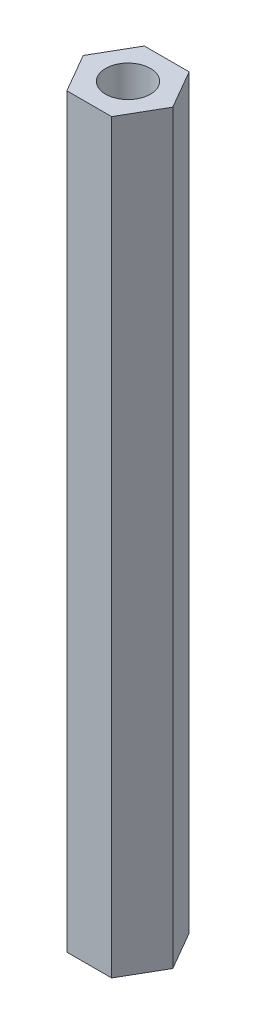
ISO-10303-21;
HEADER;
FILE_DESCRIPTION(('STEP AP214'),'2;1');
FILE_NAME('part.step','',(''),(''),'','','');
FILE_SCHEMA(('AUTOMOTIVE_DESIGN { 1 0 10303 214 1 1 1 1 }'));
ENDSEC;
DATA;
#1=APPLICATION_CONTEXT('core data for automotive mechanical design processes');
#2=APPLICATION_PROTOCOL_DEFINITION('international standard','automotive_design',2000,#1);
#3=PRODUCT_CONTEXT('',#1,'mechanical');
#4=PRODUCT('Part','Part','',(#3));
#5=PRODUCT_RELATED_PRODUCT_CATEGORY('part','',(#4));
#6=PRODUCT_DEFINITION_FORMATION('','',#4);
#7=PRODUCT_DEFINITION_CONTEXT('part definition',#1,'design');
#8=PRODUCT_DEFINITION('design','',#6,#7);
#9=PRODUCT_DEFINITION_SHAPE('','',#8);
#10=(LENGTH_UNIT() NAMED_UNIT(*) SI_UNIT(.MILLI.,.METRE.));
#11=(NAMED_UNIT(*) PLANE_ANGLE_UNIT() SI_UNIT($,.RADIAN.));
#12=(NAMED_UNIT(*) SI_UNIT($,.STERADIAN.) SOLID_ANGLE_UNIT());
#13=UNCERTAINTY_MEASURE_WITH_UNIT(LENGTH_MEASURE(1.E-05),#10,'distance_accuracy_value','');
#14=(GEOMETRIC_REPRESENTATION_CONTEXT(3) GLOBAL_UNCERTAINTY_ASSIGNED_CONTEXT((#13)) GLOBAL_UNIT_ASSIGNED_CONTEXT((#10,
#11,#12)) REPRESENTATION_CONTEXT('',''));
#15=CARTESIAN_POINT('',(0.,0.,0.));
#16=DIRECTION('',(0.,0.,1.));
#17=DIRECTION('',(1.,0.,0.));
#18=AXIS2_PLACEMENT_3D('',#15,#16,#17);
#19=CARTESIAN_POINT('',(0.,50.,0.));
#20=DIRECTION('',(0.,1.,0.));
#21=DIRECTION('',(0.,0.,1.));
#22=AXIS2_PLACEMENT_3D('',#19,#20,#21);
#23=PLANE('',#22);
#24=DIRECTION('',(-0.5,0.,-0.866025403784439));
#25=VECTOR('',#24,1.);
#26=CARTESIAN_POINT('',(3.,50.,0.));
#27=LINE('',#26,#25);
#28=CARTESIAN_POINT('',(3.,50.,0.));
#29=VERTEX_POINT('',#28);
#30=CARTESIAN_POINT('',(1.5,50.,-2.59807621135332));
#31=VERTEX_POINT('',#30);
#32=EDGE_CURVE('E133',#29,#31,#27,.T.);
#33=ORIENTED_EDGE('',*,*,#32,.T.);
#34=DIRECTION('',(-1.,0.,0.));
#35=VECTOR('',#34,1.);
#36=CARTESIAN_POINT('',(1.5,50.,-2.59807621135332));
#37=LINE('',#36,#35);
#38=CARTESIAN_POINT('',(-1.5,50.,-2.59807621135332));
#39=VERTEX_POINT('',#38);
#40=EDGE_CURVE('E91',#31,#39,#37,.T.);
#41=ORIENTED_EDGE('',*,*,#40,.T.);
#42=DIRECTION('',(-0.5,0.,0.866025403784439));
#43=VECTOR('',#42,1.);
#44=CARTESIAN_POINT('',(-1.5,50.,-2.59807621135332));
#45=LINE('',#44,#43);
#46=CARTESIAN_POINT('',(-3.,50.,0.));
#47=VERTEX_POINT('',#46);
#48=EDGE_CURVE('E104',#39,#47,#45,.T.);
#49=ORIENTED_EDGE('',*,*,#48,.T.);
#50=DIRECTION('',(0.5,0.,0.866025403784439));
#51=VECTOR('',#50,1.);
#52=CARTESIAN_POINT('',(-3.,50.,0.));
#53=LINE('',#52,#51);
#54=CARTESIAN_POINT('',(-1.5,50.,2.59807621135332));
#55=VERTEX_POINT('',#54);
#56=EDGE_CURVE('E98',#47,#55,#53,.T.);
#57=ORIENTED_EDGE('',*,*,#56,.T.);
#58=DIRECTION('',(1.,0.,0.));
#59=VECTOR('',#58,1.);
#60=CARTESIAN_POINT('',(-1.5,50.,2.59807621135332));
#61=LINE('',#60,#59);
#62=CARTESIAN_POINT('',(1.5,50.,2.59807621135332));
#63=VERTEX_POINT('',#62);
#64=EDGE_CURVE('E102',#55,#63,#61,.T.);
#65=ORIENTED_EDGE('',*,*,#64,.T.);
#66=DIRECTION('',(0.5,0.,-0.866025403784438));
#67=VECTOR('',#66,1.);
#68=CARTESIAN_POINT('',(1.5,50.,2.59807621135332));
#69=LINE('',#68,#67);
#70=EDGE_CURVE('E54',#63,#29,#69,.T.);
#71=ORIENTED_EDGE('',*,*,#70,.T.);
#72=EDGE_LOOP('',(#33,#41,#49,#57,#65,#71));
#73=FACE_BOUND('',#72,.T.);
#74=CARTESIAN_POINT('',(0.,50.,0.));
#75=DIRECTION('',(0.,1.,0.));
#76=DIRECTION('',(0.,0.,1.));
#77=AXIS2_PLACEMENT_3D('',#74,#75,#76);
#78=CIRCLE('',#77,1.5);
#79=CARTESIAN_POINT('',(0.,50.,1.5));
#80=VERTEX_POINT('',#79);
#81=EDGE_CURVE('E126',#80,#80,#78,.T.);
#82=ORIENTED_EDGE('',*,*,#81,.F.);
#83=EDGE_LOOP('',(#82));
#84=FACE_BOUND('',#83,.T.);
#85=ADVANCED_FACE('F37',(#73,#84),#23,.T.);
#86=CARTESIAN_POINT('',(0.,0.,0.));
#87=DIRECTION('',(0.,1.,0.));
#88=DIRECTION('',(0.,0.,1.));
#89=AXIS2_PLACEMENT_3D('',#86,#87,#88);
#90=PLANE('',#89);
#91=DIRECTION('',(-0.5,0.,-0.866025403784439));
#92=VECTOR('',#91,1.);
#93=CARTESIAN_POINT('',(3.,0.,0.));
#94=LINE('',#93,#92);
#95=CARTESIAN_POINT('',(3.,0.,0.));
#96=VERTEX_POINT('',#95);
#97=CARTESIAN_POINT('',(1.5,0.,-2.59807621135332));
#98=VERTEX_POINT('',#97);
#99=EDGE_CURVE('E122',#96,#98,#94,.T.);
#100=ORIENTED_EDGE('',*,*,#99,.F.);
#101=DIRECTION('',(0.5,0.,-0.866025403784438));
#102=VECTOR('',#101,1.);
#103=CARTESIAN_POINT('',(1.5,0.,2.59807621135332));
#104=LINE('',#103,#102);
#105=CARTESIAN_POINT('',(1.5,0.,2.59807621135332));
#106=VERTEX_POINT('',#105);
#107=EDGE_CURVE('E83',#106,#96,#104,.T.);
#108=ORIENTED_EDGE('',*,*,#107,.F.);
#109=DIRECTION('',(1.,0.,0.));
#110=VECTOR('',#109,1.);
#111=CARTESIAN_POINT('',(-1.5,0.,2.59807621135332));
#112=LINE('',#111,#110);
#113=CARTESIAN_POINT('',(-1.5,0.,2.59807621135332));
#114=VERTEX_POINT('',#113);
#115=EDGE_CURVE('E77',#114,#106,#112,.T.);
#116=ORIENTED_EDGE('',*,*,#115,.F.);
#117=DIRECTION('',(0.5,0.,0.866025403784439));
#118=VECTOR('',#117,1.);
#119=CARTESIAN_POINT('',(-3.,0.,0.));
#120=LINE('',#119,#118);
#121=CARTESIAN_POINT('',(-3.,0.,0.));
#122=VERTEX_POINT('',#121);
#123=EDGE_CURVE('E112',#122,#114,#120,.T.);
#124=ORIENTED_EDGE('',*,*,#123,.F.);
#125=DIRECTION('',(-0.5,0.,0.866025403784439));
#126=VECTOR('',#125,1.);
#127=CARTESIAN_POINT('',(-1.5,0.,-2.59807621135332));
#128=LINE('',#127,#126);
#129=CARTESIAN_POINT('',(-1.5,0.,-2.59807621135332));
#130=VERTEX_POINT('',#129);
#131=EDGE_CURVE('E128',#130,#122,#128,.T.);
#132=ORIENTED_EDGE('',*,*,#131,.F.);
#133=DIRECTION('',(-1.,0.,0.));
#134=VECTOR('',#133,1.);
#135=CARTESIAN_POINT('',(1.5,0.,-2.59807621135332));
#136=LINE('',#135,#134);
#137=EDGE_CURVE('E125',#98,#130,#136,.T.);
#138=ORIENTED_EDGE('',*,*,#137,.F.);
#139=EDGE_LOOP('',(#100,#108,#116,#124,#132,#138));
#140=FACE_BOUND('',#139,.T.);
#141=CARTESIAN_POINT('',(0.,0.,0.));
#142=DIRECTION('',(0.,1.,0.));
#143=DIRECTION('',(0.,0.,1.));
#144=AXIS2_PLACEMENT_3D('',#141,#142,#143);
#145=CIRCLE('',#144,1.5);
#146=CARTESIAN_POINT('',(0.,0.,1.5));
#147=VERTEX_POINT('',#146);
#148=EDGE_CURVE('E244',#147,#147,#145,.T.);
#149=ORIENTED_EDGE('',*,*,#148,.T.);
#150=EDGE_LOOP('',(#149));
#151=FACE_BOUND('',#150,.T.);
#152=ADVANCED_FACE('F142',(#140,#151),#90,.F.);
#153=CARTESIAN_POINT('',(3.,50.,0.));
#154=DIRECTION('',(-0.866025403784439,0.,0.5));
#155=DIRECTION('',(0.5,0.,0.866025403784439));
#156=AXIS2_PLACEMENT_3D('',#153,#154,#155);
#157=PLANE('',#156);
#158=ORIENTED_EDGE('',*,*,#99,.T.);
#159=DIRECTION('',(0.,-1.,0.));
#160=VECTOR('',#159,1.);
#161=CARTESIAN_POINT('',(1.5,50.,-2.59807621135332));
#162=LINE('',#161,#160);
#163=EDGE_CURVE('E11',#31,#98,#162,.T.);
#164=ORIENTED_EDGE('',*,*,#163,.F.);
#165=ORIENTED_EDGE('',*,*,#32,.F.);
#166=DIRECTION('',(0.,-1.,0.));
#167=VECTOR('',#166,1.);
#168=CARTESIAN_POINT('',(3.,50.,0.));
#169=LINE('',#168,#167);
#170=EDGE_CURVE('E118',#29,#96,#169,.T.);
#171=ORIENTED_EDGE('',*,*,#170,.T.);
#172=EDGE_LOOP('',(#158,#164,#165,#171));
#173=FACE_BOUND('',#172,.T.);
#174=ADVANCED_FACE('F39',(#173),#157,.F.);
#175=CARTESIAN_POINT('',(1.5,50.,-2.59807621135332));
#176=DIRECTION('',(0.,0.,1.));
#177=DIRECTION('',(1.,0.,0.));
#178=AXIS2_PLACEMENT_3D('',#175,#176,#177);
#179=PLANE('',#178);
#180=ORIENTED_EDGE('',*,*,#137,.T.);
#181=DIRECTION('',(0.,-1.,0.));
#182=VECTOR('',#181,1.);
#183=CARTESIAN_POINT('',(-1.5,50.,-2.59807621135332));
#184=LINE('',#183,#182);
#185=EDGE_CURVE('E46',#39,#130,#184,.T.);
#186=ORIENTED_EDGE('',*,*,#185,.F.);
#187=ORIENTED_EDGE('',*,*,#40,.F.);
#188=ORIENTED_EDGE('',*,*,#163,.T.);
#189=EDGE_LOOP('',(#180,#186,#187,#188));
#190=FACE_BOUND('',#189,.T.);
#191=ADVANCED_FACE('F167',(#190),#179,.F.);
#192=CARTESIAN_POINT('',(-1.5,50.,-2.59807621135332));
#193=DIRECTION('',(0.866025403784439,0.,0.5));
#194=DIRECTION('',(0.5,0.,-0.866025403784439));
#195=AXIS2_PLACEMENT_3D('',#192,#193,#194);
#196=PLANE('',#195);
#197=ORIENTED_EDGE('',*,*,#131,.T.);
#198=DIRECTION('',(0.,-1.,0.));
#199=VECTOR('',#198,1.);
#200=CARTESIAN_POINT('',(-3.,50.,0.));
#201=LINE('',#200,#199);
#202=EDGE_CURVE('E113',#47,#122,#201,.T.);
#203=ORIENTED_EDGE('',*,*,#202,.F.);
#204=ORIENTED_EDGE('',*,*,#48,.F.);
#205=ORIENTED_EDGE('',*,*,#185,.T.);
#206=EDGE_LOOP('',(#197,#203,#204,#205));
#207=FACE_BOUND('',#206,.T.);
#208=ADVANCED_FACE('F139',(#207),#196,.F.);
#209=CARTESIAN_POINT('',(-3.,50.,0.));
#210=DIRECTION('',(0.866025403784439,0.,-0.5));
#211=DIRECTION('',(-0.5,0.,-0.866025403784439));
#212=AXIS2_PLACEMENT_3D('',#209,#210,#211);
#213=PLANE('',#212);
#214=ORIENTED_EDGE('',*,*,#123,.T.);
#215=DIRECTION('',(0.,-1.,0.));
#216=VECTOR('',#215,1.);
#217=CARTESIAN_POINT('',(-1.5,50.,2.59807621135332));
#218=LINE('',#217,#216);
#219=EDGE_CURVE('E109',#55,#114,#218,.T.);
#220=ORIENTED_EDGE('',*,*,#219,.F.);
#221=ORIENTED_EDGE('',*,*,#56,.F.);
#222=ORIENTED_EDGE('',*,*,#202,.T.);
#223=EDGE_LOOP('',(#214,#220,#221,#222));
#224=FACE_BOUND('',#223,.T.);
#225=ADVANCED_FACE('F110',(#224),#213,.F.);
#226=CARTESIAN_POINT('',(-1.5,50.,2.59807621135332));
#227=DIRECTION('',(0.,0.,-1.));
#228=DIRECTION('',(-1.,0.,0.));
#229=AXIS2_PLACEMENT_3D('',#226,#227,#228);
#230=PLANE('',#229);
#231=ORIENTED_EDGE('',*,*,#115,.T.);
#232=DIRECTION('',(0.,-1.,0.));
#233=VECTOR('',#232,1.);
#234=CARTESIAN_POINT('',(1.5,50.,2.59807621135332));
#235=LINE('',#234,#233);
#236=EDGE_CURVE('E114',#63,#106,#235,.T.);
#237=ORIENTED_EDGE('',*,*,#236,.F.);
#238=ORIENTED_EDGE('',*,*,#64,.F.);
#239=ORIENTED_EDGE('',*,*,#219,.T.);
#240=EDGE_LOOP('',(#231,#237,#238,#239));
#241=FACE_BOUND('',#240,.T.);
#242=ADVANCED_FACE('F116',(#241),#230,.F.);
#243=CARTESIAN_POINT('',(1.5,50.,2.59807621135332));
#244=DIRECTION('',(-0.866025403784438,0.,-0.5));
#245=DIRECTION('',(-0.5,0.,0.866025403784439));
#246=AXIS2_PLACEMENT_3D('',#243,#244,#245);
#247=PLANE('',#246);
#248=ORIENTED_EDGE('',*,*,#107,.T.);
#249=ORIENTED_EDGE('',*,*,#170,.F.);
#250=ORIENTED_EDGE('',*,*,#70,.F.);
#251=ORIENTED_EDGE('',*,*,#236,.T.);
#252=EDGE_LOOP('',(#248,#249,#250,#251));
#253=FACE_BOUND('',#252,.T.);
#254=ADVANCED_FACE('F147',(#253),#247,.F.);
#255=CARTESIAN_POINT('',(0.,50.,0.));
#256=DIRECTION('',(0.,-1.,0.));
#257=DIRECTION('',(0.,0.,-1.));
#258=AXIS2_PLACEMENT_3D('',#255,#256,#257);
#259=CYLINDRICAL_SURFACE('',#258,1.5);
#260=ORIENTED_EDGE('',*,*,#81,.T.);
#261=EDGE_LOOP('',(#260));
#262=FACE_BOUND('',#261,.T.);
#263=ORIENTED_EDGE('',*,*,#148,.F.);
#264=EDGE_LOOP('',(#263));
#265=FACE_BOUND('',#264,.T.);
#266=ADVANCED_FACE('F149',(#262,#265),#259,.F.);
#267=CLOSED_SHELL('',(#85,#152,#174,#191,#208,#225,#242,#254,#266));
#268=MANIFOLD_SOLID_BREP('B2',#267);
#269=ADVANCED_BREP_SHAPE_REPRESENTATION('',(#18,#268),#14);
#270=SHAPE_DEFINITION_REPRESENTATION(#9,#269);
ENDSEC;
END-ISO-10303-21;
